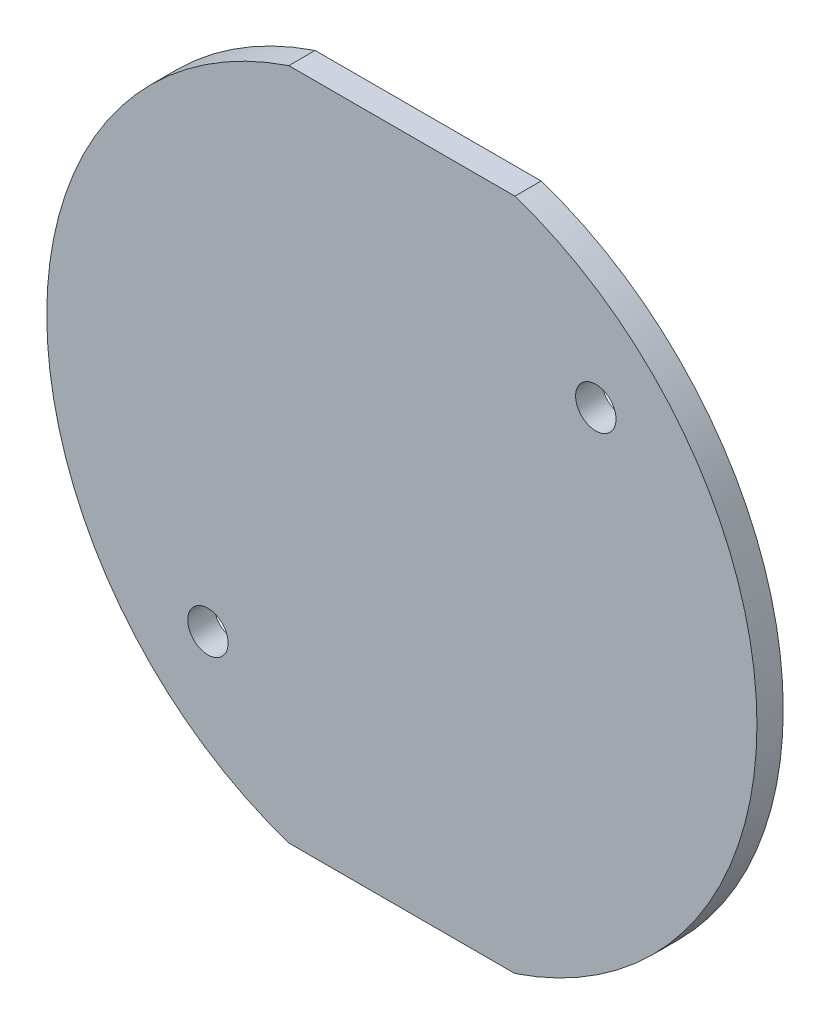
ISO-10303-21;
HEADER;
FILE_DESCRIPTION(('STEP AP214'),'2;1');
FILE_NAME('part.step','',(''),(''),'','','');
FILE_SCHEMA(('AUTOMOTIVE_DESIGN { 1 0 10303 214 1 1 1 1 }'));
ENDSEC;
DATA;
#1=APPLICATION_CONTEXT('core data for automotive mechanical design processes');
#2=APPLICATION_PROTOCOL_DEFINITION('international standard','automotive_design',2000,#1);
#3=PRODUCT_CONTEXT('',#1,'mechanical');
#4=PRODUCT('Part','Part','',(#3));
#5=PRODUCT_RELATED_PRODUCT_CATEGORY('part','',(#4));
#6=PRODUCT_DEFINITION_FORMATION('','',#4);
#7=PRODUCT_DEFINITION_CONTEXT('part definition',#1,'design');
#8=PRODUCT_DEFINITION('design','',#6,#7);
#9=PRODUCT_DEFINITION_SHAPE('','',#8);
#10=(LENGTH_UNIT() NAMED_UNIT(*) SI_UNIT(.MILLI.,.METRE.));
#11=(NAMED_UNIT(*) PLANE_ANGLE_UNIT() SI_UNIT($,.RADIAN.));
#12=(NAMED_UNIT(*) SI_UNIT($,.STERADIAN.) SOLID_ANGLE_UNIT());
#13=UNCERTAINTY_MEASURE_WITH_UNIT(LENGTH_MEASURE(1.E-05),#10,'distance_accuracy_value','');
#14=(GEOMETRIC_REPRESENTATION_CONTEXT(3) GLOBAL_UNCERTAINTY_ASSIGNED_CONTEXT((#13)) GLOBAL_UNIT_ASSIGNED_CONTEXT((#10,
#11,#12)) REPRESENTATION_CONTEXT('',''));
#15=CARTESIAN_POINT('',(0.,0.,0.));
#16=DIRECTION('',(0.,0.,1.));
#17=DIRECTION('',(1.,0.,0.));
#18=AXIS2_PLACEMENT_3D('',#15,#16,#17);
#19=CARTESIAN_POINT('',(0.,0.,1.6256));
#20=DIRECTION('',(0.,0.,-1.));
#21=DIRECTION('',(-1.,0.,0.));
#22=AXIS2_PLACEMENT_3D('',#19,#20,#21);
#23=CYLINDRICAL_SURFACE('',#22,21.971);
#24=CARTESIAN_POINT('',(0.,0.,1.6256));
#25=DIRECTION('',(0.,0.,1.));
#26=DIRECTION('',(1.,0.,0.));
#27=AXIS2_PLACEMENT_3D('',#24,#25,#26);
#28=CIRCLE('',#27,21.971);
#29=CARTESIAN_POINT('',(6.99423026501131,-20.828,1.6256));
#30=VERTEX_POINT('',#29);
#31=CARTESIAN_POINT('',(6.9942302650113,20.828,1.6256));
#32=VERTEX_POINT('',#31);
#33=EDGE_CURVE('E42',#30,#32,#28,.T.);
#34=ORIENTED_EDGE('',*,*,#33,.F.);
#35=DIRECTION('',(0.,0.,-1.));
#36=VECTOR('',#35,1.);
#37=CARTESIAN_POINT('',(6.99423026501131,-20.828,1.6256));
#38=LINE('',#37,#36);
#39=CARTESIAN_POINT('',(6.99423026501131,-20.828,0.));
#40=VERTEX_POINT('',#39);
#41=EDGE_CURVE('E77',#30,#40,#38,.T.);
#42=ORIENTED_EDGE('',*,*,#41,.T.);
#43=CARTESIAN_POINT('',(0.,0.,0.));
#44=DIRECTION('',(0.,0.,1.));
#45=DIRECTION('',(1.,0.,0.));
#46=AXIS2_PLACEMENT_3D('',#43,#44,#45);
#47=CIRCLE('',#46,21.971);
#48=CARTESIAN_POINT('',(6.9942302650113,20.828,0.));
#49=VERTEX_POINT('',#48);
#50=EDGE_CURVE('E57',#40,#49,#47,.T.);
#51=ORIENTED_EDGE('',*,*,#50,.T.);
#52=DIRECTION('',(0.,0.,-1.));
#53=VECTOR('',#52,1.);
#54=CARTESIAN_POINT('',(6.9942302650113,20.828,1.6256));
#55=LINE('',#54,#53);
#56=EDGE_CURVE('E94',#32,#49,#55,.T.);
#57=ORIENTED_EDGE('',*,*,#56,.F.);
#58=EDGE_LOOP('',(#34,#42,#51,#57));
#59=FACE_BOUND('',#58,.T.);
#60=ADVANCED_FACE('F33',(#59),#23,.T.);
#61=CARTESIAN_POINT('',(-6.9942302650113,20.828,0.));
#62=VERTEX_POINT('',#61);
#63=CARTESIAN_POINT('',(-6.99423026501129,-20.828,0.));
#64=VERTEX_POINT('',#63);
#65=EDGE_CURVE('E37',#62,#64,#47,.T.);
#66=ORIENTED_EDGE('',*,*,#65,.T.);
#67=DIRECTION('',(0.,0.,-1.));
#68=VECTOR('',#67,1.);
#69=CARTESIAN_POINT('',(-6.99423026501129,-20.828,1.6256));
#70=LINE('',#69,#68);
#71=CARTESIAN_POINT('',(-6.99423026501129,-20.828,1.6256));
#72=VERTEX_POINT('',#71);
#73=EDGE_CURVE('E49',#72,#64,#70,.T.);
#74=ORIENTED_EDGE('',*,*,#73,.F.);
#75=CARTESIAN_POINT('',(-6.9942302650113,20.828,1.6256));
#76=VERTEX_POINT('',#75);
#77=EDGE_CURVE('E11',#76,#72,#28,.T.);
#78=ORIENTED_EDGE('',*,*,#77,.F.);
#79=DIRECTION('',(0.,0.,-1.));
#80=VECTOR('',#79,1.);
#81=CARTESIAN_POINT('',(-6.9942302650113,20.828,1.6256));
#82=LINE('',#81,#80);
#83=EDGE_CURVE('E97',#76,#62,#82,.T.);
#84=ORIENTED_EDGE('',*,*,#83,.T.);
#85=EDGE_LOOP('',(#66,#74,#78,#84));
#86=FACE_BOUND('',#85,.T.);
#87=ADVANCED_FACE('F35',(#86),#23,.T.);
#88=CARTESIAN_POINT('',(0.,0.,1.6256));
#89=DIRECTION('',(0.,0.,1.));
#90=DIRECTION('',(1.,0.,0.));
#91=AXIS2_PLACEMENT_3D('',#88,#89,#90);
#92=PLANE('',#91);
#93=DIRECTION('',(1.,0.,0.));
#94=VECTOR('',#93,1.);
#95=CARTESIAN_POINT('',(6.99423026501131,-20.828,1.6256));
#96=LINE('',#95,#94);
#97=EDGE_CURVE('E75',#72,#30,#96,.T.);
#98=ORIENTED_EDGE('',*,*,#97,.T.);
#99=ORIENTED_EDGE('',*,*,#33,.T.);
#100=DIRECTION('',(-1.,0.,0.));
#101=VECTOR('',#100,1.);
#102=CARTESIAN_POINT('',(6.9942302650113,20.828,1.6256));
#103=LINE('',#102,#101);
#104=EDGE_CURVE('E92',#32,#76,#103,.T.);
#105=ORIENTED_EDGE('',*,*,#104,.T.);
#106=ORIENTED_EDGE('',*,*,#77,.T.);
#107=EDGE_LOOP('',(#98,#99,#105,#106));
#108=FACE_BOUND('',#107,.T.);
#109=CARTESIAN_POINT('',(-12.,-12.,1.6256));
#110=DIRECTION('',(0.,0.,1.));
#111=DIRECTION('',(1.,0.,0.));
#112=AXIS2_PLACEMENT_3D('',#109,#110,#111);
#113=CIRCLE('',#112,1.25);
#114=CARTESIAN_POINT('',(-10.75,-12.,1.6256));
#115=VERTEX_POINT('',#114);
#116=EDGE_CURVE('E102',#115,#115,#113,.T.);
#117=ORIENTED_EDGE('',*,*,#116,.F.);
#118=EDGE_LOOP('',(#117));
#119=FACE_BOUND('',#118,.T.);
#120=CARTESIAN_POINT('',(12.,12.,1.6256));
#121=DIRECTION('',(0.,0.,1.));
#122=DIRECTION('',(1.,0.,0.));
#123=AXIS2_PLACEMENT_3D('',#120,#121,#122);
#124=CIRCLE('',#123,1.25);
#125=CARTESIAN_POINT('',(13.25,12.,1.6256));
#126=VERTEX_POINT('',#125);
#127=EDGE_CURVE('E107',#126,#126,#124,.T.);
#128=ORIENTED_EDGE('',*,*,#127,.F.);
#129=EDGE_LOOP('',(#128));
#130=FACE_BOUND('',#129,.T.);
#131=ADVANCED_FACE('F89',(#108,#119,#130),#92,.T.);
#132=CARTESIAN_POINT('',(0.,0.,0.));
#133=DIRECTION('',(0.,0.,1.));
#134=DIRECTION('',(1.,0.,0.));
#135=AXIS2_PLACEMENT_3D('',#132,#133,#134);
#136=PLANE('',#135);
#137=CARTESIAN_POINT('',(-12.,-12.,0.));
#138=DIRECTION('',(0.,0.,1.));
#139=DIRECTION('',(1.,0.,0.));
#140=AXIS2_PLACEMENT_3D('',#137,#138,#139);
#141=CIRCLE('',#140,1.25);
#142=CARTESIAN_POINT('',(-10.75,-12.,0.));
#143=VERTEX_POINT('',#142);
#144=EDGE_CURVE('E104',#143,#143,#141,.T.);
#145=ORIENTED_EDGE('',*,*,#144,.T.);
#146=EDGE_LOOP('',(#145));
#147=FACE_BOUND('',#146,.T.);
#148=CARTESIAN_POINT('',(12.,12.,0.));
#149=DIRECTION('',(0.,0.,1.));
#150=DIRECTION('',(1.,0.,0.));
#151=AXIS2_PLACEMENT_3D('',#148,#149,#150);
#152=CIRCLE('',#151,1.25);
#153=CARTESIAN_POINT('',(13.25,12.,0.));
#154=VERTEX_POINT('',#153);
#155=EDGE_CURVE('E110',#154,#154,#152,.T.);
#156=ORIENTED_EDGE('',*,*,#155,.T.);
#157=EDGE_LOOP('',(#156));
#158=FACE_BOUND('',#157,.T.);
#159=ORIENTED_EDGE('',*,*,#50,.F.);
#160=DIRECTION('',(1.,0.,0.));
#161=VECTOR('',#160,1.);
#162=CARTESIAN_POINT('',(6.99423026501131,-20.828,0.));
#163=LINE('',#162,#161);
#164=EDGE_CURVE('E80',#64,#40,#163,.T.);
#165=ORIENTED_EDGE('',*,*,#164,.F.);
#166=ORIENTED_EDGE('',*,*,#65,.F.);
#167=DIRECTION('',(-1.,0.,0.));
#168=VECTOR('',#167,1.);
#169=CARTESIAN_POINT('',(6.9942302650113,20.828,0.));
#170=LINE('',#169,#168);
#171=EDGE_CURVE('E95',#49,#62,#170,.T.);
#172=ORIENTED_EDGE('',*,*,#171,.F.);
#173=EDGE_LOOP('',(#159,#165,#166,#172));
#174=FACE_BOUND('',#173,.T.);
#175=ADVANCED_FACE('F119',(#147,#158,#174),#136,.F.);
#176=CARTESIAN_POINT('',(12.,12.,0.));
#177=DIRECTION('',(0.,0.,1.));
#178=DIRECTION('',(1.,0.,0.));
#179=AXIS2_PLACEMENT_3D('',#176,#177,#178);
#180=CYLINDRICAL_SURFACE('',#179,1.25);
#181=ORIENTED_EDGE('',*,*,#155,.F.);
#182=EDGE_LOOP('',(#181));
#183=FACE_BOUND('',#182,.T.);
#184=ORIENTED_EDGE('',*,*,#127,.T.);
#185=EDGE_LOOP('',(#184));
#186=FACE_BOUND('',#185,.T.);
#187=ADVANCED_FACE('F116',(#183,#186),#180,.F.);
#188=CARTESIAN_POINT('',(-12.,-12.,0.));
#189=DIRECTION('',(0.,0.,1.));
#190=DIRECTION('',(1.,0.,0.));
#191=AXIS2_PLACEMENT_3D('',#188,#189,#190);
#192=CYLINDRICAL_SURFACE('',#191,1.25);
#193=ORIENTED_EDGE('',*,*,#144,.F.);
#194=EDGE_LOOP('',(#193));
#195=FACE_BOUND('',#194,.T.);
#196=ORIENTED_EDGE('',*,*,#116,.T.);
#197=EDGE_LOOP('',(#196));
#198=FACE_BOUND('',#197,.T.);
#199=ADVANCED_FACE('F136',(#195,#198),#192,.F.);
#200=CARTESIAN_POINT('',(6.9942302650113,20.828,1.6256));
#201=DIRECTION('',(0.,-1.,0.));
#202=DIRECTION('',(0.,0.,-1.));
#203=AXIS2_PLACEMENT_3D('',#200,#201,#202);
#204=PLANE('',#203);
#205=ORIENTED_EDGE('',*,*,#171,.T.);
#206=ORIENTED_EDGE('',*,*,#83,.F.);
#207=ORIENTED_EDGE('',*,*,#104,.F.);
#208=ORIENTED_EDGE('',*,*,#56,.T.);
#209=EDGE_LOOP('',(#205,#206,#207,#208));
#210=FACE_BOUND('',#209,.T.);
#211=ADVANCED_FACE('F132',(#210),#204,.F.);
#212=CARTESIAN_POINT('',(6.99423026501131,-20.828,1.6256));
#213=DIRECTION('',(0.,1.,0.));
#214=DIRECTION('',(0.,0.,1.));
#215=AXIS2_PLACEMENT_3D('',#212,#213,#214);
#216=PLANE('',#215);
#217=ORIENTED_EDGE('',*,*,#164,.T.);
#218=ORIENTED_EDGE('',*,*,#41,.F.);
#219=ORIENTED_EDGE('',*,*,#97,.F.);
#220=ORIENTED_EDGE('',*,*,#73,.T.);
#221=EDGE_LOOP('',(#217,#218,#219,#220));
#222=FACE_BOUND('',#221,.T.);
#223=ADVANCED_FACE('F76',(#222),#216,.F.);
#224=CLOSED_SHELL('',(#60,#87,#131,#175,#187,#199,#211,#223));
#225=MANIFOLD_SOLID_BREP('B2',#224);
#226=ADVANCED_BREP_SHAPE_REPRESENTATION('',(#18,#225),#14);
#227=SHAPE_DEFINITION_REPRESENTATION(#9,#226);
ENDSEC;
END-ISO-10303-21;
